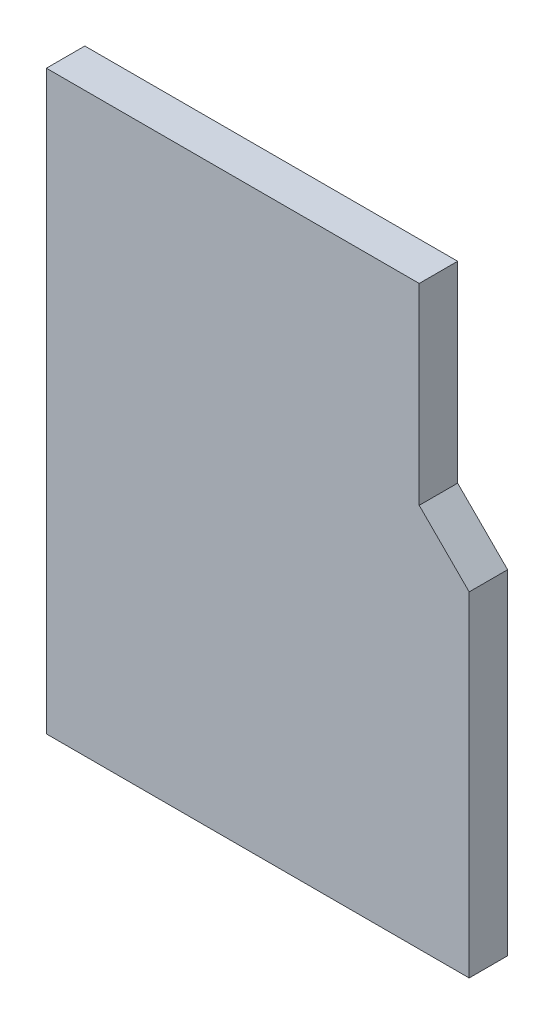
ISO-10303-21;
HEADER;
FILE_DESCRIPTION(('STEP AP214'),'2;1');
FILE_NAME('part.step','',(''),(''),'','','');
FILE_SCHEMA(('AUTOMOTIVE_DESIGN { 1 0 10303 214 1 1 1 1 }'));
ENDSEC;
DATA;
#1=APPLICATION_CONTEXT('core data for automotive mechanical design processes');
#2=APPLICATION_PROTOCOL_DEFINITION('international standard','automotive_design',2000,#1);
#3=PRODUCT_CONTEXT('',#1,'mechanical');
#4=PRODUCT('Part','Part','',(#3));
#5=PRODUCT_RELATED_PRODUCT_CATEGORY('part','',(#4));
#6=PRODUCT_DEFINITION_FORMATION('','',#4);
#7=PRODUCT_DEFINITION_CONTEXT('part definition',#1,'design');
#8=PRODUCT_DEFINITION('design','',#6,#7);
#9=PRODUCT_DEFINITION_SHAPE('','',#8);
#10=(LENGTH_UNIT() NAMED_UNIT(*) SI_UNIT(.MILLI.,.METRE.));
#11=(NAMED_UNIT(*) PLANE_ANGLE_UNIT() SI_UNIT($,.RADIAN.));
#12=(NAMED_UNIT(*) SI_UNIT($,.STERADIAN.) SOLID_ANGLE_UNIT());
#13=UNCERTAINTY_MEASURE_WITH_UNIT(LENGTH_MEASURE(1.E-05),#10,'distance_accuracy_value','');
#14=(GEOMETRIC_REPRESENTATION_CONTEXT(3) GLOBAL_UNCERTAINTY_ASSIGNED_CONTEXT((#13)) GLOBAL_UNIT_ASSIGNED_CONTEXT((#10,
#11,#12)) REPRESENTATION_CONTEXT('',''));
#15=CARTESIAN_POINT('',(0.,0.,0.));
#16=DIRECTION('',(0.,0.,1.));
#17=DIRECTION('',(1.,0.,0.));
#18=AXIS2_PLACEMENT_3D('',#15,#16,#17);
#19=CARTESIAN_POINT('',(11.,0.,1.));
#20=DIRECTION('',(0.,1.,0.));
#21=DIRECTION('',(-1.,0.,0.));
#22=AXIS2_PLACEMENT_3D('',#19,#20,#21);
#23=PLANE('',#22);
#24=DIRECTION('',(1.,0.,0.));
#25=VECTOR('',#24,1.);
#26=CARTESIAN_POINT('',(11.,0.,0.));
#27=LINE('',#26,#25);
#28=CARTESIAN_POINT('',(0.,0.,0.));
#29=VERTEX_POINT('',#28);
#30=CARTESIAN_POINT('',(11.,0.,0.));
#31=VERTEX_POINT('',#30);
#32=EDGE_CURVE('E118',#29,#31,#27,.T.);
#33=ORIENTED_EDGE('',*,*,#32,.T.);
#34=DIRECTION('',(0.,0.,-1.));
#35=VECTOR('',#34,1.);
#36=CARTESIAN_POINT('',(11.,0.,1.));
#37=LINE('',#36,#35);
#38=CARTESIAN_POINT('',(11.,0.,1.));
#39=VERTEX_POINT('',#38);
#40=EDGE_CURVE('E11',#39,#31,#37,.T.);
#41=ORIENTED_EDGE('',*,*,#40,.F.);
#42=DIRECTION('',(1.,0.,0.));
#43=VECTOR('',#42,1.);
#44=CARTESIAN_POINT('',(11.,0.,1.));
#45=LINE('',#44,#43);
#46=CARTESIAN_POINT('',(0.,0.,1.));
#47=VERTEX_POINT('',#46);
#48=EDGE_CURVE('E128',#47,#39,#45,.T.);
#49=ORIENTED_EDGE('',*,*,#48,.F.);
#50=DIRECTION('',(0.,0.,-1.));
#51=VECTOR('',#50,1.);
#52=CARTESIAN_POINT('',(0.,0.,1.));
#53=LINE('',#52,#51);
#54=EDGE_CURVE('E114',#47,#29,#53,.T.);
#55=ORIENTED_EDGE('',*,*,#54,.T.);
#56=EDGE_LOOP('',(#33,#41,#49,#55));
#57=FACE_BOUND('',#56,.T.);
#58=ADVANCED_FACE('F34',(#57),#23,.F.);
#59=CARTESIAN_POINT('',(11.,8.70000000000001,1.));
#60=DIRECTION('',(-1.,0.,0.));
#61=DIRECTION('',(0.,-1.,0.));
#62=AXIS2_PLACEMENT_3D('',#59,#60,#61);
#63=PLANE('',#62);
#64=DIRECTION('',(0.,1.,0.));
#65=VECTOR('',#64,1.);
#66=CARTESIAN_POINT('',(11.,8.70000000000001,0.));
#67=LINE('',#66,#65);
#68=CARTESIAN_POINT('',(11.,8.70000000000001,0.));
#69=VERTEX_POINT('',#68);
#70=EDGE_CURVE('E121',#31,#69,#67,.T.);
#71=ORIENTED_EDGE('',*,*,#70,.T.);
#72=DIRECTION('',(0.,0.,-1.));
#73=VECTOR('',#72,1.);
#74=CARTESIAN_POINT('',(11.,8.70000000000001,1.));
#75=LINE('',#74,#73);
#76=CARTESIAN_POINT('',(11.,8.70000000000001,1.));
#77=VERTEX_POINT('',#76);
#78=EDGE_CURVE('E42',#77,#69,#75,.T.);
#79=ORIENTED_EDGE('',*,*,#78,.F.);
#80=DIRECTION('',(0.,1.,0.));
#81=VECTOR('',#80,1.);
#82=CARTESIAN_POINT('',(11.,8.70000000000001,1.));
#83=LINE('',#82,#81);
#84=EDGE_CURVE('E87',#39,#77,#83,.T.);
#85=ORIENTED_EDGE('',*,*,#84,.F.);
#86=ORIENTED_EDGE('',*,*,#40,.T.);
#87=EDGE_LOOP('',(#71,#79,#85,#86));
#88=FACE_BOUND('',#87,.T.);
#89=ADVANCED_FACE('F152',(#88),#63,.F.);
#90=CARTESIAN_POINT('',(9.7,10.,1.));
#91=DIRECTION('',(-0.707106781186545,-0.70710678118655,0.));
#92=DIRECTION('',(0.70710678118655,-0.707106781186545,0.));
#93=AXIS2_PLACEMENT_3D('',#90,#91,#92);
#94=PLANE('',#93);
#95=DIRECTION('',(-0.70710678118655,0.707106781186545,0.));
#96=VECTOR('',#95,1.);
#97=CARTESIAN_POINT('',(9.7,10.,0.));
#98=LINE('',#97,#96);
#99=CARTESIAN_POINT('',(9.7,10.,0.));
#100=VERTEX_POINT('',#99);
#101=EDGE_CURVE('E123',#69,#100,#98,.T.);
#102=ORIENTED_EDGE('',*,*,#101,.T.);
#103=DIRECTION('',(0.,0.,-1.));
#104=VECTOR('',#103,1.);
#105=CARTESIAN_POINT('',(9.7,10.,1.));
#106=LINE('',#105,#104);
#107=CARTESIAN_POINT('',(9.7,10.,1.));
#108=VERTEX_POINT('',#107);
#109=EDGE_CURVE('E109',#108,#100,#106,.T.);
#110=ORIENTED_EDGE('',*,*,#109,.F.);
#111=DIRECTION('',(-0.70710678118655,0.707106781186545,0.));
#112=VECTOR('',#111,1.);
#113=CARTESIAN_POINT('',(9.7,10.,1.));
#114=LINE('',#113,#112);
#115=EDGE_CURVE('E100',#77,#108,#114,.T.);
#116=ORIENTED_EDGE('',*,*,#115,.F.);
#117=ORIENTED_EDGE('',*,*,#78,.T.);
#118=EDGE_LOOP('',(#102,#110,#116,#117));
#119=FACE_BOUND('',#118,.T.);
#120=ADVANCED_FACE('F134',(#119),#94,.F.);
#121=CARTESIAN_POINT('',(9.7,15.,1.));
#122=DIRECTION('',(-1.,0.,0.));
#123=DIRECTION('',(0.,0.,1.));
#124=AXIS2_PLACEMENT_3D('',#121,#122,#123);
#125=PLANE('',#124);
#126=DIRECTION('',(0.,1.,0.));
#127=VECTOR('',#126,1.);
#128=CARTESIAN_POINT('',(9.7,15.,0.));
#129=LINE('',#128,#127);
#130=CARTESIAN_POINT('',(9.7,15.,0.));
#131=VERTEX_POINT('',#130);
#132=EDGE_CURVE('E108',#100,#131,#129,.T.);
#133=ORIENTED_EDGE('',*,*,#132,.T.);
#134=DIRECTION('',(0.,0.,-1.));
#135=VECTOR('',#134,1.);
#136=CARTESIAN_POINT('',(9.7,15.,1.));
#137=LINE('',#136,#135);
#138=CARTESIAN_POINT('',(9.7,15.,1.));
#139=VERTEX_POINT('',#138);
#140=EDGE_CURVE('E105',#139,#131,#137,.T.);
#141=ORIENTED_EDGE('',*,*,#140,.F.);
#142=DIRECTION('',(0.,1.,0.));
#143=VECTOR('',#142,1.);
#144=CARTESIAN_POINT('',(9.7,15.,1.));
#145=LINE('',#144,#143);
#146=EDGE_CURVE('E94',#108,#139,#145,.T.);
#147=ORIENTED_EDGE('',*,*,#146,.F.);
#148=ORIENTED_EDGE('',*,*,#109,.T.);
#149=EDGE_LOOP('',(#133,#141,#147,#148));
#150=FACE_BOUND('',#149,.T.);
#151=ADVANCED_FACE('F106',(#150),#125,.F.);
#152=CARTESIAN_POINT('',(0.,15.,1.));
#153=DIRECTION('',(0.,-1.,0.));
#154=DIRECTION('',(0.,0.,-1.));
#155=AXIS2_PLACEMENT_3D('',#152,#153,#154);
#156=PLANE('',#155);
#157=DIRECTION('',(-1.,0.,0.));
#158=VECTOR('',#157,1.);
#159=CARTESIAN_POINT('',(0.,15.,0.));
#160=LINE('',#159,#158);
#161=CARTESIAN_POINT('',(0.,15.,0.));
#162=VERTEX_POINT('',#161);
#163=EDGE_CURVE('E73',#131,#162,#160,.T.);
#164=ORIENTED_EDGE('',*,*,#163,.T.);
#165=DIRECTION('',(0.,0.,-1.));
#166=VECTOR('',#165,1.);
#167=CARTESIAN_POINT('',(0.,15.,1.));
#168=LINE('',#167,#166);
#169=CARTESIAN_POINT('',(0.,15.,1.));
#170=VERTEX_POINT('',#169);
#171=EDGE_CURVE('E110',#170,#162,#168,.T.);
#172=ORIENTED_EDGE('',*,*,#171,.F.);
#173=DIRECTION('',(-1.,0.,0.));
#174=VECTOR('',#173,1.);
#175=CARTESIAN_POINT('',(0.,15.,1.));
#176=LINE('',#175,#174);
#177=EDGE_CURVE('E98',#139,#170,#176,.T.);
#178=ORIENTED_EDGE('',*,*,#177,.F.);
#179=ORIENTED_EDGE('',*,*,#140,.T.);
#180=EDGE_LOOP('',(#164,#172,#178,#179));
#181=FACE_BOUND('',#180,.T.);
#182=ADVANCED_FACE('F112',(#181),#156,.F.);
#183=CARTESIAN_POINT('',(0.,0.,1.));
#184=DIRECTION('',(1.,0.,0.));
#185=DIRECTION('',(0.,0.,-1.));
#186=AXIS2_PLACEMENT_3D('',#183,#184,#185);
#187=PLANE('',#186);
#188=DIRECTION('',(0.,-1.,0.));
#189=VECTOR('',#188,1.);
#190=CARTESIAN_POINT('',(0.,0.,0.));
#191=LINE('',#190,#189);
#192=EDGE_CURVE('E79',#162,#29,#191,.T.);
#193=ORIENTED_EDGE('',*,*,#192,.T.);
#194=ORIENTED_EDGE('',*,*,#54,.F.);
#195=DIRECTION('',(0.,-1.,0.));
#196=VECTOR('',#195,1.);
#197=CARTESIAN_POINT('',(0.,0.,1.));
#198=LINE('',#197,#196);
#199=EDGE_CURVE('E50',#170,#47,#198,.T.);
#200=ORIENTED_EDGE('',*,*,#199,.F.);
#201=ORIENTED_EDGE('',*,*,#171,.T.);
#202=EDGE_LOOP('',(#193,#194,#200,#201));
#203=FACE_BOUND('',#202,.T.);
#204=ADVANCED_FACE('F141',(#203),#187,.F.);
#205=CARTESIAN_POINT('',(0.,0.,1.));
#206=DIRECTION('',(0.,0.,-1.));
#207=DIRECTION('',(-1.,0.,0.));
#208=AXIS2_PLACEMENT_3D('',#205,#206,#207);
#209=PLANE('',#208);
#210=ORIENTED_EDGE('',*,*,#48,.T.);
#211=ORIENTED_EDGE('',*,*,#84,.T.);
#212=ORIENTED_EDGE('',*,*,#115,.T.);
#213=ORIENTED_EDGE('',*,*,#146,.T.);
#214=ORIENTED_EDGE('',*,*,#177,.T.);
#215=ORIENTED_EDGE('',*,*,#199,.T.);
#216=EDGE_LOOP('',(#210,#211,#212,#213,#214,#215));
#217=FACE_BOUND('',#216,.T.);
#218=ADVANCED_FACE('F96',(#217),#209,.F.);
#219=CARTESIAN_POINT('',(0.,0.,0.));
#220=DIRECTION('',(0.,0.,-1.));
#221=DIRECTION('',(-1.,0.,0.));
#222=AXIS2_PLACEMENT_3D('',#219,#220,#221);
#223=PLANE('',#222);
#224=ORIENTED_EDGE('',*,*,#32,.F.);
#225=ORIENTED_EDGE('',*,*,#192,.F.);
#226=ORIENTED_EDGE('',*,*,#163,.F.);
#227=ORIENTED_EDGE('',*,*,#132,.F.);
#228=ORIENTED_EDGE('',*,*,#101,.F.);
#229=ORIENTED_EDGE('',*,*,#70,.F.);
#230=EDGE_LOOP('',(#224,#225,#226,#227,#228,#229));
#231=FACE_BOUND('',#230,.T.);
#232=ADVANCED_FACE('F137',(#231),#223,.T.);
#233=CLOSED_SHELL('',(#58,#89,#120,#151,#182,#204,#218,#232));
#234=MANIFOLD_SOLID_BREP('B2',#233);
#235=ADVANCED_BREP_SHAPE_REPRESENTATION('',(#18,#234),#14);
#236=SHAPE_DEFINITION_REPRESENTATION(#9,#235);
ENDSEC;
END-ISO-10303-21;
